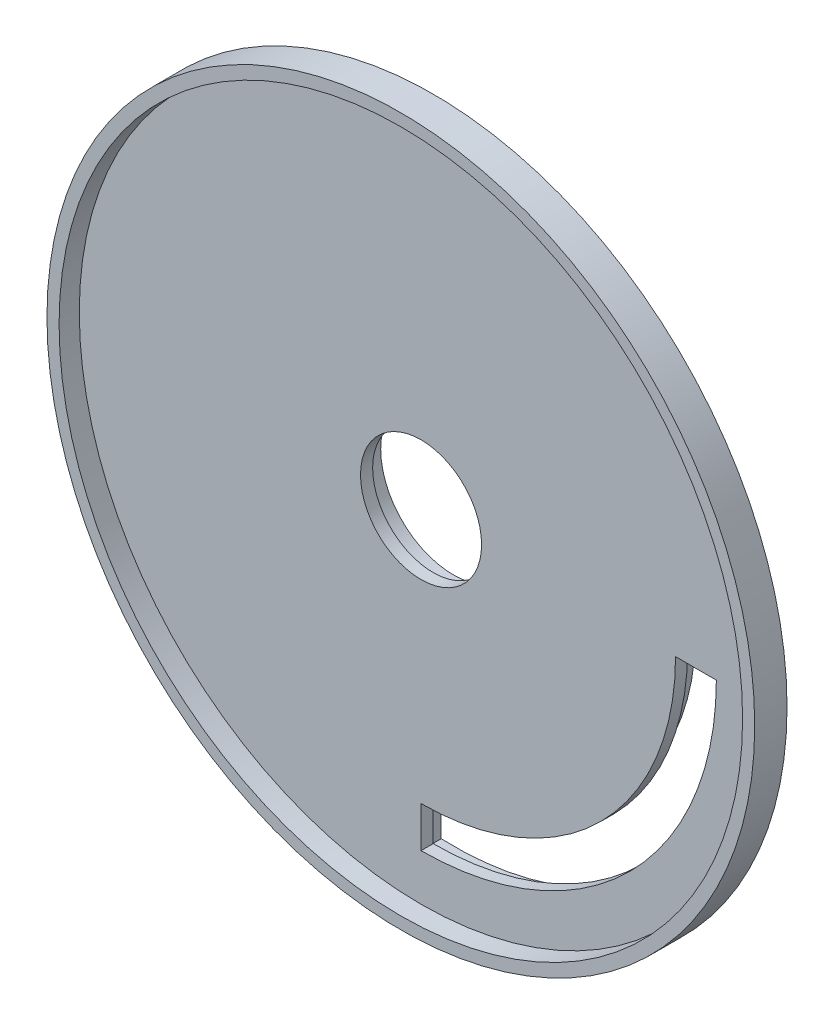
ISO-10303-21;
HEADER;
FILE_DESCRIPTION(('STEP AP214'),'2;1');
FILE_NAME('part.step','',(''),(''),'','','');
FILE_SCHEMA(('AUTOMOTIVE_DESIGN { 1 0 10303 214 1 1 1 1 }'));
ENDSEC;
DATA;
#1=APPLICATION_CONTEXT('core data for automotive mechanical design processes');
#2=APPLICATION_PROTOCOL_DEFINITION('international standard','automotive_design',2000,#1);
#3=PRODUCT_CONTEXT('',#1,'mechanical');
#4=PRODUCT('Part','Part','',(#3));
#5=PRODUCT_RELATED_PRODUCT_CATEGORY('part','',(#4));
#6=PRODUCT_DEFINITION_FORMATION('','',#4);
#7=PRODUCT_DEFINITION_CONTEXT('part definition',#1,'design');
#8=PRODUCT_DEFINITION('design','',#6,#7);
#9=PRODUCT_DEFINITION_SHAPE('','',#8);
#10=(LENGTH_UNIT() NAMED_UNIT(*) SI_UNIT(.MILLI.,.METRE.));
#11=(NAMED_UNIT(*) PLANE_ANGLE_UNIT() SI_UNIT($,.RADIAN.));
#12=(NAMED_UNIT(*) SI_UNIT($,.STERADIAN.) SOLID_ANGLE_UNIT());
#13=UNCERTAINTY_MEASURE_WITH_UNIT(LENGTH_MEASURE(1.E-05),#10,'distance_accuracy_value','');
#14=(GEOMETRIC_REPRESENTATION_CONTEXT(3) GLOBAL_UNCERTAINTY_ASSIGNED_CONTEXT((#13)) GLOBAL_UNIT_ASSIGNED_CONTEXT((#10,
#11,#12)) REPRESENTATION_CONTEXT('',''));
#15=CARTESIAN_POINT('',(0.,0.,0.));
#16=DIRECTION('',(0.,0.,1.));
#17=DIRECTION('',(1.,0.,0.));
#18=AXIS2_PLACEMENT_3D('',#15,#16,#17);
#19=CARTESIAN_POINT('',(0.,0.,0.));
#20=DIRECTION('',(0.,0.,1.));
#21=DIRECTION('',(1.,0.,0.));
#22=AXIS2_PLACEMENT_3D('',#19,#20,#21);
#23=PLANE('',#22);
#24=CARTESIAN_POINT('',(0.,0.,0.));
#25=DIRECTION('',(0.,0.,-1.));
#26=DIRECTION('',(-1.,0.,0.));
#27=AXIS2_PLACEMENT_3D('',#24,#25,#26);
#28=CIRCLE('',#27,14.9825951214007);
#29=CARTESIAN_POINT('',(-14.9825951214007,0.,0.));
#30=VERTEX_POINT('',#29);
#31=EDGE_CURVE('E284',#30,#30,#28,.T.);
#32=ORIENTED_EDGE('',*,*,#31,.F.);
#33=EDGE_LOOP('',(#32));
#34=FACE_BOUND('',#33,.T.);
#35=CARTESIAN_POINT('',(0.,0.,0.));
#36=DIRECTION('',(0.,0.,-1.));
#37=DIRECTION('',(-1.,0.,0.));
#38=AXIS2_PLACEMENT_3D('',#35,#36,#37);
#39=CIRCLE('',#38,17.9825951214007);
#40=CARTESIAN_POINT('',(-17.9825951214007,0.,0.));
#41=VERTEX_POINT('',#40);
#42=EDGE_CURVE('E297',#41,#41,#39,.T.);
#43=ORIENTED_EDGE('',*,*,#42,.T.);
#44=EDGE_LOOP('',(#43));
#45=FACE_BOUND('',#44,.T.);
#46=ADVANCED_FACE('F41',(#34,#45),#23,.F.);
#47=CARTESIAN_POINT('',(0.,0.,0.));
#48=DIRECTION('',(0.,0.,1.));
#49=DIRECTION('',(1.,0.,0.));
#50=AXIS2_PLACEMENT_3D('',#47,#48,#49);
#51=CIRCLE('',#50,20.9825951214007);
#52=CARTESIAN_POINT('',(20.9825951214007,0.,0.));
#53=VERTEX_POINT('',#52);
#54=EDGE_CURVE('E11',#53,#53,#51,.F.);
#55=ORIENTED_EDGE('',*,*,#54,.F.);
#56=EDGE_LOOP('',(#55));
#57=FACE_BOUND('',#56,.T.);
#58=CARTESIAN_POINT('',(0.,0.,0.));
#59=DIRECTION('',(0.,0.,1.));
#60=DIRECTION('',(1.,0.,0.));
#61=AXIS2_PLACEMENT_3D('',#58,#59,#60);
#62=CIRCLE('',#61,87.6);
#63=CARTESIAN_POINT('',(87.6,0.,0.));
#64=VERTEX_POINT('',#63);
#65=EDGE_CURVE('E262',#64,#64,#62,.T.);
#66=ORIENTED_EDGE('',*,*,#65,.F.);
#67=EDGE_LOOP('',(#66));
#68=FACE_BOUND('',#67,.T.);
#69=CARTESIAN_POINT('',(0.,0.,0.));
#70=DIRECTION('',(0.,0.,1.));
#71=DIRECTION('',(-1.,0.,0.));
#72=AXIS2_PLACEMENT_3D('',#69,#70,#71);
#73=CIRCLE('',#72,57.);
#74=CARTESIAN_POINT('',(-6.00000000000036,-56.6833308830735,0.));
#75=VERTEX_POINT('',#74);
#76=CARTESIAN_POINT('',(56.6833308830736,5.99999999999903,0.));
#77=VERTEX_POINT('',#76);
#78=EDGE_CURVE('E150',#75,#77,#73,.T.);
#79=ORIENTED_EDGE('',*,*,#78,.F.);
#80=DIRECTION('',(0.,1.,0.));
#81=VECTOR('',#80,1.);
#82=CARTESIAN_POINT('',(-6.00000000000036,-78.8721116745329,0.));
#83=LINE('',#82,#81);
#84=CARTESIAN_POINT('',(-6.00000000000036,-78.8721116745329,0.));
#85=VERTEX_POINT('',#84);
#86=EDGE_CURVE('E191',#85,#75,#83,.T.);
#87=ORIENTED_EDGE('',*,*,#86,.F.);
#88=CARTESIAN_POINT('',(0.,0.,0.));
#89=DIRECTION('',(0.,0.,-1.));
#90=DIRECTION('',(-1.,0.,0.));
#91=AXIS2_PLACEMENT_3D('',#88,#89,#90);
#92=CIRCLE('',#91,79.1);
#93=CARTESIAN_POINT('',(78.872111674533,5.99999999999903,0.));
#94=VERTEX_POINT('',#93);
#95=EDGE_CURVE('E62',#94,#85,#92,.T.);
#96=ORIENTED_EDGE('',*,*,#95,.F.);
#97=DIRECTION('',(1.,0.,0.));
#98=VECTOR('',#97,1.);
#99=CARTESIAN_POINT('',(56.6833308830736,5.99999999999903,0.));
#100=LINE('',#99,#98);
#101=EDGE_CURVE('E57',#77,#94,#100,.T.);
#102=ORIENTED_EDGE('',*,*,#101,.F.);
#103=EDGE_LOOP('',(#79,#87,#96,#102));
#104=FACE_BOUND('',#103,.T.);
#105=ADVANCED_FACE('F320',(#57,#68,#104),#23,.F.);
#106=DIRECTION('',(0.,1.,0.));
#107=VECTOR('',#106,1.);
#108=CARTESIAN_POINT('',(-3.00000000000036,-76.0408442877904,0.));
#109=LINE('',#108,#107);
#110=CARTESIAN_POINT('',(-3.0000000000003,-76.0408442877904,0.));
#111=VERTEX_POINT('',#110);
#112=CARTESIAN_POINT('',(-3.00000000000036,-59.9249530663145,0.));
#113=VERTEX_POINT('',#112);
#114=EDGE_CURVE('E142',#111,#113,#109,.T.);
#115=ORIENTED_EDGE('',*,*,#114,.T.);
#116=CARTESIAN_POINT('',(0.,0.,0.));
#117=DIRECTION('',(0.,0.,1.));
#118=DIRECTION('',(-1.,0.,0.));
#119=AXIS2_PLACEMENT_3D('',#116,#117,#118);
#120=CIRCLE('',#119,60.);
#121=CARTESIAN_POINT('',(59.9249530663146,2.99999999999903,0.));
#122=VERTEX_POINT('',#121);
#123=EDGE_CURVE('E166',#113,#122,#120,.T.);
#124=ORIENTED_EDGE('',*,*,#123,.T.);
#125=DIRECTION('',(1.,0.,0.));
#126=VECTOR('',#125,1.);
#127=CARTESIAN_POINT('',(59.9249530663146,2.99999999999903,0.));
#128=LINE('',#127,#126);
#129=CARTESIAN_POINT('',(76.0408442877905,2.99999999999903,0.));
#130=VERTEX_POINT('',#129);
#131=EDGE_CURVE('E148',#122,#130,#128,.T.);
#132=ORIENTED_EDGE('',*,*,#131,.T.);
#133=CARTESIAN_POINT('',(0.,0.,0.));
#134=DIRECTION('',(0.,0.,-1.));
#135=DIRECTION('',(-1.,0.,0.));
#136=AXIS2_PLACEMENT_3D('',#133,#134,#135);
#137=CIRCLE('',#136,76.1);
#138=EDGE_CURVE('E172',#130,#111,#137,.T.);
#139=ORIENTED_EDGE('',*,*,#138,.T.);
#140=EDGE_LOOP('',(#115,#124,#132,#139));
#141=FACE_BOUND('',#140,.T.);
#142=CARTESIAN_POINT('',(0.,0.,0.));
#143=DIRECTION('',(0.,0.,-1.));
#144=DIRECTION('',(-1.,0.,0.));
#145=AXIS2_PLACEMENT_3D('',#142,#143,#144);
#146=CIRCLE('',#145,63.);
#147=CARTESIAN_POINT('',(63.,0.,0.));
#148=VERTEX_POINT('',#147);
#149=CARTESIAN_POINT('',(-3.47378376064356E-13,-63.,0.));
#150=VERTEX_POINT('',#149);
#151=EDGE_CURVE('E225',#148,#150,#146,.T.);
#152=ORIENTED_EDGE('',*,*,#151,.T.);
#153=DIRECTION('',(0.,1.,0.));
#154=VECTOR('',#153,1.);
#155=CARTESIAN_POINT('',(-3.47378376064356E-13,-73.1,0.));
#156=LINE('',#155,#154);
#157=CARTESIAN_POINT('',(-3.11200960247745E-13,-73.1,0.));
#158=VERTEX_POINT('',#157);
#159=EDGE_CURVE('E229',#158,#150,#156,.T.);
#160=ORIENTED_EDGE('',*,*,#159,.F.);
#161=CARTESIAN_POINT('',(0.,0.,0.));
#162=DIRECTION('',(0.,0.,-1.));
#163=DIRECTION('',(-1.,0.,0.));
#164=AXIS2_PLACEMENT_3D('',#161,#162,#163);
#165=CIRCLE('',#164,73.1);
#166=CARTESIAN_POINT('',(73.1,3.56798109611847E-13,0.));
#167=VERTEX_POINT('',#166);
#168=EDGE_CURVE('E233',#167,#158,#165,.T.);
#169=ORIENTED_EDGE('',*,*,#168,.F.);
#170=DIRECTION('',(1.,0.,0.));
#171=VECTOR('',#170,1.);
#172=CARTESIAN_POINT('',(63.,3.55561216344708E-13,0.));
#173=LINE('',#172,#171);
#174=EDGE_CURVE('E237',#148,#167,#173,.T.);
#175=ORIENTED_EDGE('',*,*,#174,.F.);
#176=EDGE_LOOP('',(#152,#160,#169,#175));
#177=FACE_BOUND('',#176,.T.);
#178=ADVANCED_FACE('F323',(#141,#177),#23,.F.);
#179=CARTESIAN_POINT('',(0.,0.,3.));
#180=DIRECTION('',(0.,0.,1.));
#181=DIRECTION('',(1.,0.,0.));
#182=AXIS2_PLACEMENT_3D('',#179,#180,#181);
#183=PLANE('',#182);
#184=CARTESIAN_POINT('',(0.,0.,3.));
#185=DIRECTION('',(0.,0.,1.));
#186=DIRECTION('',(1.,0.,0.));
#187=AXIS2_PLACEMENT_3D('',#184,#185,#186);
#188=CIRCLE('',#187,14.9825951214007);
#189=CARTESIAN_POINT('',(14.9825951214007,0.,3.));
#190=VERTEX_POINT('',#189);
#191=EDGE_CURVE('E169',#190,#190,#188,.T.);
#192=ORIENTED_EDGE('',*,*,#191,.F.);
#193=EDGE_LOOP('',(#192));
#194=FACE_BOUND('',#193,.T.);
#195=CARTESIAN_POINT('',(0.,0.,3.));
#196=DIRECTION('',(0.,0.,1.));
#197=DIRECTION('',(1.,0.,0.));
#198=AXIS2_PLACEMENT_3D('',#195,#196,#197);
#199=CIRCLE('',#198,84.6);
#200=CARTESIAN_POINT('',(84.6,0.,3.));
#201=VERTEX_POINT('',#200);
#202=EDGE_CURVE('E266',#201,#201,#199,.F.);
#203=ORIENTED_EDGE('',*,*,#202,.F.);
#204=EDGE_LOOP('',(#203));
#205=FACE_BOUND('',#204,.T.);
#206=DIRECTION('',(0.,-1.,0.));
#207=VECTOR('',#206,1.);
#208=CARTESIAN_POINT('',(0.,0.,3.));
#209=LINE('',#208,#207);
#210=CARTESIAN_POINT('',(-3.47378376064356E-13,-63.,3.));
#211=VERTEX_POINT('',#210);
#212=CARTESIAN_POINT('',(-3.11200960247745E-13,-73.1,3.));
#213=VERTEX_POINT('',#212);
#214=EDGE_CURVE('E277',#211,#213,#209,.T.);
#215=ORIENTED_EDGE('',*,*,#214,.F.);
#216=CARTESIAN_POINT('',(0.,0.,3.));
#217=DIRECTION('',(0.,0.,1.));
#218=DIRECTION('',(1.,0.,0.));
#219=AXIS2_PLACEMENT_3D('',#216,#217,#218);
#220=CIRCLE('',#219,63.);
#221=CARTESIAN_POINT('',(63.,3.55561216344708E-13,3.));
#222=VERTEX_POINT('',#221);
#223=EDGE_CURVE('E50',#211,#222,#220,.T.);
#224=ORIENTED_EDGE('',*,*,#223,.T.);
#225=DIRECTION('',(-1.,0.,0.));
#226=VECTOR('',#225,1.);
#227=CARTESIAN_POINT('',(0.,0.,3.));
#228=LINE('',#227,#226);
#229=CARTESIAN_POINT('',(73.1,0.,3.));
#230=VERTEX_POINT('',#229);
#231=EDGE_CURVE('E270',#230,#222,#228,.T.);
#232=ORIENTED_EDGE('',*,*,#231,.F.);
#233=CARTESIAN_POINT('',(0.,0.,3.));
#234=DIRECTION('',(0.,0.,1.));
#235=DIRECTION('',(1.,0.,0.));
#236=AXIS2_PLACEMENT_3D('',#233,#234,#235);
#237=CIRCLE('',#236,73.1);
#238=EDGE_CURVE('E273',#213,#230,#237,.T.);
#239=ORIENTED_EDGE('',*,*,#238,.F.);
#240=EDGE_LOOP('',(#215,#224,#232,#239));
#241=FACE_BOUND('',#240,.T.);
#242=ADVANCED_FACE('F356',(#194,#205,#241),#183,.T.);
#243=CARTESIAN_POINT('',(0.,0.,3.));
#244=DIRECTION('',(0.,0.,-1.));
#245=DIRECTION('',(-1.,0.,0.));
#246=AXIS2_PLACEMENT_3D('',#243,#244,#245);
#247=CYLINDRICAL_SURFACE('',#246,87.6);
#248=ORIENTED_EDGE('',*,*,#65,.T.);
#249=EDGE_LOOP('',(#248));
#250=FACE_BOUND('',#249,.T.);
#251=CARTESIAN_POINT('',(0.,0.,8.));
#252=DIRECTION('',(0.,0.,1.));
#253=DIRECTION('',(1.,0.,0.));
#254=AXIS2_PLACEMENT_3D('',#251,#252,#253);
#255=CIRCLE('',#254,87.6);
#256=CARTESIAN_POINT('',(87.6,0.,8.));
#257=VERTEX_POINT('',#256);
#258=EDGE_CURVE('E258',#257,#257,#255,.T.);
#259=ORIENTED_EDGE('',*,*,#258,.F.);
#260=EDGE_LOOP('',(#259));
#261=FACE_BOUND('',#260,.T.);
#262=ADVANCED_FACE('F43',(#250,#261),#247,.T.);
#263=CARTESIAN_POINT('',(0.,0.,8.));
#264=DIRECTION('',(0.,0.,1.));
#265=DIRECTION('',(1.,0.,0.));
#266=AXIS2_PLACEMENT_3D('',#263,#264,#265);
#267=PLANE('',#266);
#268=ORIENTED_EDGE('',*,*,#258,.T.);
#269=EDGE_LOOP('',(#268));
#270=FACE_BOUND('',#269,.T.);
#271=CARTESIAN_POINT('',(0.,0.,8.));
#272=DIRECTION('',(0.,0.,1.));
#273=DIRECTION('',(1.,0.,0.));
#274=AXIS2_PLACEMENT_3D('',#271,#272,#273);
#275=CIRCLE('',#274,84.6);
#276=CARTESIAN_POINT('',(84.6,0.,8.));
#277=VERTEX_POINT('',#276);
#278=EDGE_CURVE('E254',#277,#277,#275,.T.);
#279=ORIENTED_EDGE('',*,*,#278,.F.);
#280=EDGE_LOOP('',(#279));
#281=FACE_BOUND('',#280,.T.);
#282=ADVANCED_FACE('F396',(#270,#281),#267,.T.);
#283=CARTESIAN_POINT('',(0.,0.,8.));
#284=DIRECTION('',(0.,0.,-1.));
#285=DIRECTION('',(-1.,0.,0.));
#286=AXIS2_PLACEMENT_3D('',#283,#284,#285);
#287=CYLINDRICAL_SURFACE('',#286,84.6);
#288=ORIENTED_EDGE('',*,*,#278,.T.);
#289=EDGE_LOOP('',(#288));
#290=FACE_BOUND('',#289,.T.);
#291=ORIENTED_EDGE('',*,*,#202,.T.);
#292=EDGE_LOOP('',(#291));
#293=FACE_BOUND('',#292,.T.);
#294=ADVANCED_FACE('F393',(#290,#293),#287,.F.);
#295=CARTESIAN_POINT('',(0.,0.,5.));
#296=DIRECTION('',(0.,0.,-1.));
#297=DIRECTION('',(-1.,0.,0.));
#298=AXIS2_PLACEMENT_3D('',#295,#296,#297);
#299=CYLINDRICAL_SURFACE('',#298,63.);
#300=DIRECTION('',(0.,0.,-1.));
#301=VECTOR('',#300,1.);
#302=CARTESIAN_POINT('',(-3.47378376064356E-13,-63.,5.));
#303=LINE('',#302,#301);
#304=EDGE_CURVE('E251',#211,#150,#303,.T.);
#305=ORIENTED_EDGE('',*,*,#304,.T.);
#306=ORIENTED_EDGE('',*,*,#151,.F.);
#307=DIRECTION('',(0.,0.,-1.));
#308=VECTOR('',#307,1.);
#309=CARTESIAN_POINT('',(63.,3.55561216344708E-13,5.));
#310=LINE('',#309,#308);
#311=EDGE_CURVE('E241',#222,#148,#310,.T.);
#312=ORIENTED_EDGE('',*,*,#311,.F.);
#313=ORIENTED_EDGE('',*,*,#223,.F.);
#314=EDGE_LOOP('',(#305,#306,#312,#313));
#315=FACE_BOUND('',#314,.T.);
#316=ADVANCED_FACE('F369',(#315),#299,.T.);
#317=CARTESIAN_POINT('',(-3.47378376064356E-13,-73.1,5.));
#318=DIRECTION('',(-1.,0.,0.));
#319=DIRECTION('',(0.,0.,1.));
#320=AXIS2_PLACEMENT_3D('',#317,#318,#319);
#321=PLANE('',#320);
#322=ORIENTED_EDGE('',*,*,#214,.T.);
#323=DIRECTION('',(0.,0.,-1.));
#324=VECTOR('',#323,1.);
#325=CARTESIAN_POINT('',(-3.11200960247745E-13,-73.1,5.));
#326=LINE('',#325,#324);
#327=EDGE_CURVE('E248',#213,#158,#326,.T.);
#328=ORIENTED_EDGE('',*,*,#327,.T.);
#329=ORIENTED_EDGE('',*,*,#159,.T.);
#330=ORIENTED_EDGE('',*,*,#304,.F.);
#331=EDGE_LOOP('',(#322,#328,#329,#330));
#332=FACE_BOUND('',#331,.T.);
#333=ADVANCED_FACE('F378',(#332),#321,.F.);
#334=CARTESIAN_POINT('',(0.,0.,5.));
#335=DIRECTION('',(0.,0.,-1.));
#336=DIRECTION('',(-1.,0.,0.));
#337=AXIS2_PLACEMENT_3D('',#334,#335,#336);
#338=CYLINDRICAL_SURFACE('',#337,73.1);
#339=ORIENTED_EDGE('',*,*,#238,.T.);
#340=DIRECTION('',(0.,0.,-1.));
#341=VECTOR('',#340,1.);
#342=CARTESIAN_POINT('',(73.1,3.56798109611847E-13,5.));
#343=LINE('',#342,#341);
#344=EDGE_CURVE('E245',#230,#167,#343,.T.);
#345=ORIENTED_EDGE('',*,*,#344,.T.);
#346=ORIENTED_EDGE('',*,*,#168,.T.);
#347=ORIENTED_EDGE('',*,*,#327,.F.);
#348=EDGE_LOOP('',(#339,#345,#346,#347));
#349=FACE_BOUND('',#348,.T.);
#350=ADVANCED_FACE('F381',(#349),#338,.F.);
#351=CARTESIAN_POINT('',(63.,3.55561216344708E-13,5.));
#352=DIRECTION('',(0.,1.,0.));
#353=DIRECTION('',(-1.,0.,0.));
#354=AXIS2_PLACEMENT_3D('',#351,#352,#353);
#355=PLANE('',#354);
#356=ORIENTED_EDGE('',*,*,#231,.T.);
#357=ORIENTED_EDGE('',*,*,#311,.T.);
#358=ORIENTED_EDGE('',*,*,#174,.T.);
#359=ORIENTED_EDGE('',*,*,#344,.F.);
#360=EDGE_LOOP('',(#356,#357,#358,#359));
#361=FACE_BOUND('',#360,.T.);
#362=ADVANCED_FACE('F372',(#361),#355,.F.);
#363=CARTESIAN_POINT('',(0.,0.,-5.));
#364=DIRECTION('',(0.,0.,-1.));
#365=DIRECTION('',(-1.,0.,0.));
#366=AXIS2_PLACEMENT_3D('',#363,#364,#365);
#367=PLANE('',#366);
#368=CARTESIAN_POINT('',(0.,0.,-5.));
#369=DIRECTION('',(0.,0.,1.));
#370=DIRECTION('',(-1.,0.,0.));
#371=AXIS2_PLACEMENT_3D('',#368,#369,#370);
#372=CIRCLE('',#371,57.);
#373=CARTESIAN_POINT('',(-6.00000000000036,-56.6833308830735,-5.));
#374=VERTEX_POINT('',#373);
#375=CARTESIAN_POINT('',(56.6833308830736,5.99999999999903,-5.));
#376=VERTEX_POINT('',#375);
#377=EDGE_CURVE('E186',#374,#376,#372,.T.);
#378=ORIENTED_EDGE('',*,*,#377,.T.);
#379=DIRECTION('',(1.,0.,0.));
#380=VECTOR('',#379,1.);
#381=CARTESIAN_POINT('',(56.6833308830736,5.99999999999903,-5.));
#382=LINE('',#381,#380);
#383=CARTESIAN_POINT('',(78.872111674533,5.99999999999903,-5.));
#384=VERTEX_POINT('',#383);
#385=EDGE_CURVE('E190',#376,#384,#382,.T.);
#386=ORIENTED_EDGE('',*,*,#385,.T.);
#387=CARTESIAN_POINT('',(0.,0.,-5.));
#388=DIRECTION('',(0.,0.,-1.));
#389=DIRECTION('',(-1.,0.,0.));
#390=AXIS2_PLACEMENT_3D('',#387,#388,#389);
#391=CIRCLE('',#390,79.1);
#392=CARTESIAN_POINT('',(-6.00000000000037,-78.8721116745329,-5.));
#393=VERTEX_POINT('',#392);
#394=EDGE_CURVE('E194',#384,#393,#391,.T.);
#395=ORIENTED_EDGE('',*,*,#394,.T.);
#396=DIRECTION('',(0.,1.,0.));
#397=VECTOR('',#396,1.);
#398=CARTESIAN_POINT('',(-6.00000000000036,-78.8721116745329,-5.));
#399=LINE('',#398,#397);
#400=EDGE_CURVE('E197',#393,#374,#399,.T.);
#401=ORIENTED_EDGE('',*,*,#400,.T.);
#402=EDGE_LOOP('',(#378,#386,#395,#401));
#403=FACE_BOUND('',#402,.T.);
#404=DIRECTION('',(1.,0.,0.));
#405=VECTOR('',#404,1.);
#406=CARTESIAN_POINT('',(59.9249530663146,2.99999999999903,-5.));
#407=LINE('',#406,#405);
#408=CARTESIAN_POINT('',(59.9249530663146,2.99999999999903,-5.));
#409=VERTEX_POINT('',#408);
#410=CARTESIAN_POINT('',(76.0408442877905,2.99999999999903,-5.));
#411=VERTEX_POINT('',#410);
#412=EDGE_CURVE('E141',#409,#411,#407,.T.);
#413=ORIENTED_EDGE('',*,*,#412,.F.);
#414=CARTESIAN_POINT('',(0.,0.,-5.));
#415=DIRECTION('',(0.,0.,1.));
#416=DIRECTION('',(-1.,0.,0.));
#417=AXIS2_PLACEMENT_3D('',#414,#415,#416);
#418=CIRCLE('',#417,60.);
#419=CARTESIAN_POINT('',(-3.00000000000036,-59.9249530663145,-5.));
#420=VERTEX_POINT('',#419);
#421=EDGE_CURVE('E130',#420,#409,#418,.T.);
#422=ORIENTED_EDGE('',*,*,#421,.F.);
#423=DIRECTION('',(0.,1.,0.));
#424=VECTOR('',#423,1.);
#425=CARTESIAN_POINT('',(-3.00000000000036,-76.0408442877904,-5.));
#426=LINE('',#425,#424);
#427=CARTESIAN_POINT('',(-3.00000000000036,-76.0408442877904,-5.));
#428=VERTEX_POINT('',#427);
#429=EDGE_CURVE('E160',#428,#420,#426,.T.);
#430=ORIENTED_EDGE('',*,*,#429,.F.);
#431=CARTESIAN_POINT('',(0.,0.,-5.));
#432=DIRECTION('',(0.,0.,-1.));
#433=DIRECTION('',(-1.,0.,0.));
#434=AXIS2_PLACEMENT_3D('',#431,#432,#433);
#435=CIRCLE('',#434,76.1);
#436=EDGE_CURVE('E156',#411,#428,#435,.T.);
#437=ORIENTED_EDGE('',*,*,#436,.F.);
#438=EDGE_LOOP('',(#413,#422,#430,#437));
#439=FACE_BOUND('',#438,.T.);
#440=ADVANCED_FACE('F154',(#403,#439),#367,.T.);
#441=CARTESIAN_POINT('',(0.,0.,-5.));
#442=DIRECTION('',(0.,0.,1.));
#443=DIRECTION('',(1.,0.,0.));
#444=AXIS2_PLACEMENT_3D('',#441,#442,#443);
#445=CYLINDRICAL_SURFACE('',#444,57.);
#446=ORIENTED_EDGE('',*,*,#78,.T.);
#447=DIRECTION('',(0.,0.,1.));
#448=VECTOR('',#447,1.);
#449=CARTESIAN_POINT('',(56.6833308830736,5.99999999999903,-5.));
#450=LINE('',#449,#448);
#451=EDGE_CURVE('E222',#376,#77,#450,.T.);
#452=ORIENTED_EDGE('',*,*,#451,.F.);
#453=ORIENTED_EDGE('',*,*,#377,.F.);
#454=DIRECTION('',(0.,0.,1.));
#455=VECTOR('',#454,1.);
#456=CARTESIAN_POINT('',(-6.00000000000036,-56.6833308830735,-5.));
#457=LINE('',#456,#455);
#458=EDGE_CURVE('E200',#374,#75,#457,.T.);
#459=ORIENTED_EDGE('',*,*,#458,.T.);
#460=EDGE_LOOP('',(#446,#452,#453,#459));
#461=FACE_BOUND('',#460,.T.);
#462=ADVANCED_FACE('F333',(#461),#445,.F.);
#463=CARTESIAN_POINT('',(56.6833308830736,5.99999999999903,-5.));
#464=DIRECTION('',(0.,-1.,0.));
#465=DIRECTION('',(0.,0.,-1.));
#466=AXIS2_PLACEMENT_3D('',#463,#464,#465);
#467=PLANE('',#466);
#468=ORIENTED_EDGE('',*,*,#101,.T.);
#469=DIRECTION('',(0.,0.,1.));
#470=VECTOR('',#469,1.);
#471=CARTESIAN_POINT('',(78.872111674533,5.99999999999903,-5.));
#472=LINE('',#471,#470);
#473=EDGE_CURVE('E218',#384,#94,#472,.T.);
#474=ORIENTED_EDGE('',*,*,#473,.F.);
#475=ORIENTED_EDGE('',*,*,#385,.F.);
#476=ORIENTED_EDGE('',*,*,#451,.T.);
#477=EDGE_LOOP('',(#468,#474,#475,#476));
#478=FACE_BOUND('',#477,.T.);
#479=ADVANCED_FACE('F340',(#478),#467,.F.);
#480=CARTESIAN_POINT('',(0.,0.,-5.));
#481=DIRECTION('',(0.,0.,1.));
#482=DIRECTION('',(1.,0.,0.));
#483=AXIS2_PLACEMENT_3D('',#480,#481,#482);
#484=CYLINDRICAL_SURFACE('',#483,79.1);
#485=ORIENTED_EDGE('',*,*,#95,.T.);
#486=DIRECTION('',(0.,0.,1.));
#487=VECTOR('',#486,1.);
#488=CARTESIAN_POINT('',(-6.00000000000037,-78.8721116745329,-5.));
#489=LINE('',#488,#487);
#490=EDGE_CURVE('E214',#393,#85,#489,.T.);
#491=ORIENTED_EDGE('',*,*,#490,.F.);
#492=ORIENTED_EDGE('',*,*,#394,.F.);
#493=ORIENTED_EDGE('',*,*,#473,.T.);
#494=EDGE_LOOP('',(#485,#491,#492,#493));
#495=FACE_BOUND('',#494,.T.);
#496=ADVANCED_FACE('F338',(#495),#484,.T.);
#497=CARTESIAN_POINT('',(-6.00000000000036,-78.8721116745329,-5.));
#498=DIRECTION('',(1.,0.,0.));
#499=DIRECTION('',(0.,0.,-1.));
#500=AXIS2_PLACEMENT_3D('',#497,#498,#499);
#501=PLANE('',#500);
#502=ORIENTED_EDGE('',*,*,#86,.T.);
#503=ORIENTED_EDGE('',*,*,#458,.F.);
#504=ORIENTED_EDGE('',*,*,#400,.F.);
#505=ORIENTED_EDGE('',*,*,#490,.T.);
#506=EDGE_LOOP('',(#502,#503,#504,#505));
#507=FACE_BOUND('',#506,.T.);
#508=ADVANCED_FACE('F329',(#507),#501,.F.);
#509=CARTESIAN_POINT('',(0.,0.,-5.));
#510=DIRECTION('',(0.,0.,1.));
#511=DIRECTION('',(1.,0.,0.));
#512=AXIS2_PLACEMENT_3D('',#509,#510,#511);
#513=CYLINDRICAL_SURFACE('',#512,60.);
#514=ORIENTED_EDGE('',*,*,#123,.F.);
#515=DIRECTION('',(0.,0.,1.));
#516=VECTOR('',#515,1.);
#517=CARTESIAN_POINT('',(-3.00000000000036,-59.9249530663145,-5.));
#518=LINE('',#517,#516);
#519=EDGE_CURVE('E136',#420,#113,#518,.T.);
#520=ORIENTED_EDGE('',*,*,#519,.F.);
#521=ORIENTED_EDGE('',*,*,#421,.T.);
#522=DIRECTION('',(0.,0.,1.));
#523=VECTOR('',#522,1.);
#524=CARTESIAN_POINT('',(59.9249530663146,2.99999999999903,-5.));
#525=LINE('',#524,#523);
#526=EDGE_CURVE('E134',#409,#122,#525,.T.);
#527=ORIENTED_EDGE('',*,*,#526,.T.);
#528=EDGE_LOOP('',(#514,#520,#521,#527));
#529=FACE_BOUND('',#528,.T.);
#530=ADVANCED_FACE('F133',(#529),#513,.T.);
#531=CARTESIAN_POINT('',(59.9249530663146,2.99999999999903,-5.));
#532=DIRECTION('',(0.,-1.,0.));
#533=DIRECTION('',(0.,0.,-1.));
#534=AXIS2_PLACEMENT_3D('',#531,#532,#533);
#535=PLANE('',#534);
#536=ORIENTED_EDGE('',*,*,#131,.F.);
#537=ORIENTED_EDGE('',*,*,#526,.F.);
#538=ORIENTED_EDGE('',*,*,#412,.T.);
#539=DIRECTION('',(0.,0.,1.));
#540=VECTOR('',#539,1.);
#541=CARTESIAN_POINT('',(76.0408442877905,2.99999999999903,-5.));
#542=LINE('',#541,#540);
#543=EDGE_CURVE('E151',#411,#130,#542,.T.);
#544=ORIENTED_EDGE('',*,*,#543,.T.);
#545=EDGE_LOOP('',(#536,#537,#538,#544));
#546=FACE_BOUND('',#545,.T.);
#547=ADVANCED_FACE('F145',(#546),#535,.T.);
#548=CARTESIAN_POINT('',(0.,0.,-5.));
#549=DIRECTION('',(0.,0.,1.));
#550=DIRECTION('',(1.,0.,0.));
#551=AXIS2_PLACEMENT_3D('',#548,#549,#550);
#552=CYLINDRICAL_SURFACE('',#551,76.1);
#553=ORIENTED_EDGE('',*,*,#138,.F.);
#554=ORIENTED_EDGE('',*,*,#543,.F.);
#555=ORIENTED_EDGE('',*,*,#436,.T.);
#556=DIRECTION('',(0.,0.,1.));
#557=VECTOR('',#556,1.);
#558=CARTESIAN_POINT('',(-3.0000000000003,-76.0408442877904,-5.));
#559=LINE('',#558,#557);
#560=EDGE_CURVE('E181',#428,#111,#559,.T.);
#561=ORIENTED_EDGE('',*,*,#560,.T.);
#562=EDGE_LOOP('',(#553,#554,#555,#561));
#563=FACE_BOUND('',#562,.T.);
#564=ADVANCED_FACE('F472',(#563),#552,.F.);
#565=CARTESIAN_POINT('',(-3.00000000000036,-76.0408442877904,-5.));
#566=DIRECTION('',(1.,0.,0.));
#567=DIRECTION('',(0.,0.,-1.));
#568=AXIS2_PLACEMENT_3D('',#565,#566,#567);
#569=PLANE('',#568);
#570=ORIENTED_EDGE('',*,*,#114,.F.);
#571=ORIENTED_EDGE('',*,*,#560,.F.);
#572=ORIENTED_EDGE('',*,*,#429,.T.);
#573=ORIENTED_EDGE('',*,*,#519,.T.);
#574=EDGE_LOOP('',(#570,#571,#572,#573));
#575=FACE_BOUND('',#574,.T.);
#576=ADVANCED_FACE('F425',(#575),#569,.T.);
#577=CARTESIAN_POINT('',(0.,0.,5.));
#578=DIRECTION('',(0.,0.,-1.));
#579=DIRECTION('',(-1.,0.,0.));
#580=AXIS2_PLACEMENT_3D('',#577,#578,#579);
#581=CYLINDRICAL_SURFACE('',#580,14.9825951214007);
#582=ORIENTED_EDGE('',*,*,#191,.T.);
#583=EDGE_LOOP('',(#582));
#584=FACE_BOUND('',#583,.T.);
#585=ORIENTED_EDGE('',*,*,#31,.T.);
#586=EDGE_LOOP('',(#585));
#587=FACE_BOUND('',#586,.T.);
#588=ADVANCED_FACE('F430',(#584,#587),#581,.F.);
#589=CARTESIAN_POINT('',(0.,0.,-5.));
#590=DIRECTION('',(0.,0.,1.));
#591=DIRECTION('',(1.,0.,0.));
#592=AXIS2_PLACEMENT_3D('',#589,#590,#591);
#593=CYLINDRICAL_SURFACE('',#592,17.9825951214007);
#594=CARTESIAN_POINT('',(0.,0.,-5.));
#595=DIRECTION('',(0.,0.,-1.));
#596=DIRECTION('',(-1.,0.,0.));
#597=AXIS2_PLACEMENT_3D('',#594,#595,#596);
#598=CIRCLE('',#597,17.9825951214007);
#599=CARTESIAN_POINT('',(-17.9825951214007,0.,-5.));
#600=VERTEX_POINT('',#599);
#601=EDGE_CURVE('E294',#600,#600,#598,.T.);
#602=ORIENTED_EDGE('',*,*,#601,.T.);
#603=EDGE_LOOP('',(#602));
#604=FACE_BOUND('',#603,.T.);
#605=ORIENTED_EDGE('',*,*,#42,.F.);
#606=EDGE_LOOP('',(#605));
#607=FACE_BOUND('',#606,.T.);
#608=ADVANCED_FACE('F305',(#604,#607),#593,.F.);
#609=CARTESIAN_POINT('',(0.,0.,-5.));
#610=DIRECTION('',(0.,0.,1.));
#611=DIRECTION('',(1.,0.,0.));
#612=AXIS2_PLACEMENT_3D('',#609,#610,#611);
#613=CYLINDRICAL_SURFACE('',#612,20.9825951214007);
#614=CARTESIAN_POINT('',(0.,0.,-5.));
#615=DIRECTION('',(0.,0.,-1.));
#616=DIRECTION('',(-1.,0.,0.));
#617=AXIS2_PLACEMENT_3D('',#614,#615,#616);
#618=CIRCLE('',#617,20.9825951214007);
#619=CARTESIAN_POINT('',(-20.9825951214007,0.,-5.));
#620=VERTEX_POINT('',#619);
#621=EDGE_CURVE('E289',#620,#620,#618,.T.);
#622=ORIENTED_EDGE('',*,*,#621,.F.);
#623=EDGE_LOOP('',(#622));
#624=FACE_BOUND('',#623,.T.);
#625=ORIENTED_EDGE('',*,*,#54,.T.);
#626=EDGE_LOOP('',(#625));
#627=FACE_BOUND('',#626,.T.);
#628=ADVANCED_FACE('F311',(#624,#627),#613,.T.);
#629=CARTESIAN_POINT('',(0.,0.,-5.));
#630=DIRECTION('',(0.,0.,-1.));
#631=DIRECTION('',(-1.,0.,0.));
#632=AXIS2_PLACEMENT_3D('',#629,#630,#631);
#633=PLANE('',#632);
#634=ORIENTED_EDGE('',*,*,#601,.F.);
#635=EDGE_LOOP('',(#634));
#636=FACE_BOUND('',#635,.T.);
#637=ORIENTED_EDGE('',*,*,#621,.T.);
#638=EDGE_LOOP('',(#637));
#639=FACE_BOUND('',#638,.T.);
#640=ADVANCED_FACE('F308',(#636,#639),#633,.T.);
#641=CLOSED_SHELL('',(#46,#105,#178,#242,#262,#282,#294,#316,#333,#350,#362,#440,#462,#479,#496,
#508,#530,#547,#564,#576,#588,#608,#628,#640));
#642=MANIFOLD_SOLID_BREP('B2',#641);
#643=ADVANCED_BREP_SHAPE_REPRESENTATION('',(#18,#642),#14);
#644=SHAPE_DEFINITION_REPRESENTATION(#9,#643);
ENDSEC;
END-ISO-10303-21;
